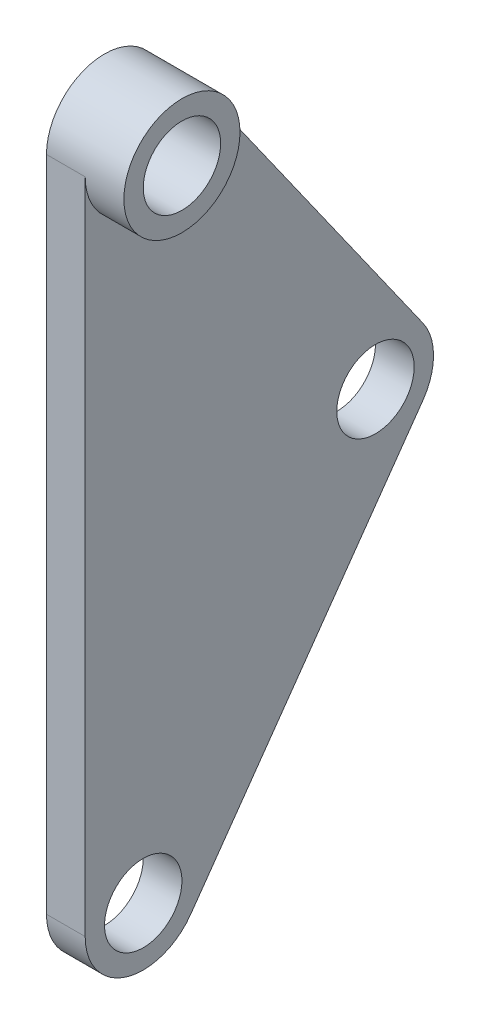
ISO-10303-21;
HEADER;
FILE_DESCRIPTION(('STEP AP214'),'2;1');
FILE_NAME('part.step','',(''),(''),'','','');
FILE_SCHEMA(('AUTOMOTIVE_DESIGN { 1 0 10303 214 1 1 1 1 }'));
ENDSEC;
DATA;
#1=APPLICATION_CONTEXT('core data for automotive mechanical design processes');
#2=APPLICATION_PROTOCOL_DEFINITION('international standard','automotive_design',2000,#1);
#3=PRODUCT_CONTEXT('',#1,'mechanical');
#4=PRODUCT('Part','Part','',(#3));
#5=PRODUCT_RELATED_PRODUCT_CATEGORY('part','',(#4));
#6=PRODUCT_DEFINITION_FORMATION('','',#4);
#7=PRODUCT_DEFINITION_CONTEXT('part definition',#1,'design');
#8=PRODUCT_DEFINITION('design','',#6,#7);
#9=PRODUCT_DEFINITION_SHAPE('','',#8);
#10=(LENGTH_UNIT() NAMED_UNIT(*) SI_UNIT(.MILLI.,.METRE.));
#11=(NAMED_UNIT(*) PLANE_ANGLE_UNIT() SI_UNIT($,.RADIAN.));
#12=(NAMED_UNIT(*) SI_UNIT($,.STERADIAN.) SOLID_ANGLE_UNIT());
#13=UNCERTAINTY_MEASURE_WITH_UNIT(LENGTH_MEASURE(1.E-05),#10,'distance_accuracy_value','');
#14=(GEOMETRIC_REPRESENTATION_CONTEXT(3) GLOBAL_UNCERTAINTY_ASSIGNED_CONTEXT((#13)) GLOBAL_UNIT_ASSIGNED_CONTEXT((#10,
#11,#12)) REPRESENTATION_CONTEXT('',''));
#15=CARTESIAN_POINT('',(0.,0.,0.));
#16=DIRECTION('',(0.,0.,1.));
#17=DIRECTION('',(1.,0.,0.));
#18=AXIS2_PLACEMENT_3D('',#15,#16,#17);
#19=CARTESIAN_POINT('',(2.,2.14575398078673,-3.03981813944787));
#20=DIRECTION('',(0.,0.576683197598655,-0.816967863264762));
#21=DIRECTION('',(0.,0.816967863264762,0.576683197598655));
#22=AXIS2_PLACEMENT_3D('',#19,#20,#21);
#23=PLANE('',#22);
#24=DIRECTION('',(0.,-0.816967863264762,-0.576683197598655));
#25=VECTOR('',#24,1.);
#26=CARTESIAN_POINT('',(0.,2.14575398078673,-3.03981813944787));
#27=LINE('',#26,#25);
#28=CARTESIAN_POINT('',(0.,-1.26995040720403,-5.45090358979429));
#29=VERTEX_POINT('',#28);
#30=CARTESIAN_POINT('',(0.,-18.269950407204,-17.4509035897943));
#31=VERTEX_POINT('',#30);
#32=EDGE_CURVE('E196',#29,#31,#27,.T.);
#33=ORIENTED_EDGE('',*,*,#32,.F.);
#34=DIRECTION('',(-1.,0.,0.));
#35=VECTOR('',#34,1.);
#36=CARTESIAN_POINT('',(2.,-1.26995040720403,-5.45090358979429));
#37=LINE('',#36,#35);
#38=CARTESIAN_POINT('',(2.,-1.26995040720403,-5.45090358979428));
#39=VERTEX_POINT('',#38);
#40=EDGE_CURVE('E212',#39,#29,#37,.T.);
#41=ORIENTED_EDGE('',*,*,#40,.F.);
#42=DIRECTION('',(0.,-0.816967863264762,-0.576683197598655));
#43=VECTOR('',#42,1.);
#44=CARTESIAN_POINT('',(2.,2.14575398078673,-3.03981813944787));
#45=LINE('',#44,#43);
#46=CARTESIAN_POINT('',(2.,-18.269950407204,-17.4509035897943));
#47=VERTEX_POINT('',#46);
#48=EDGE_CURVE('E187',#39,#47,#45,.T.);
#49=ORIENTED_EDGE('',*,*,#48,.T.);
#50=DIRECTION('',(-1.,0.,0.));
#51=VECTOR('',#50,1.);
#52=CARTESIAN_POINT('',(2.,-18.269950407204,-17.4509035897943));
#53=LINE('',#52,#51);
#54=EDGE_CURVE('E115',#47,#31,#53,.T.);
#55=ORIENTED_EDGE('',*,*,#54,.T.);
#56=EDGE_LOOP('',(#33,#41,#49,#55));
#57=FACE_BOUND('',#56,.T.);
#58=ADVANCED_FACE('F104',(#57),#23,.T.);
#59=CARTESIAN_POINT('',(2.,0.,0.));
#60=DIRECTION('',(0.,0.,-1.));
#61=DIRECTION('',(-1.,0.,0.));
#62=AXIS2_PLACEMENT_3D('',#59,#60,#61);
#63=PLANE('',#62);
#64=DIRECTION('',(0.,-1.,0.));
#65=VECTOR('',#64,1.);
#66=CARTESIAN_POINT('',(0.,0.,0.));
#67=LINE('',#66,#65);
#68=CARTESIAN_POINT('',(0.,-3.,0.));
#69=VERTEX_POINT('',#68);
#70=CARTESIAN_POINT('',(0.,-37.,0.));
#71=VERTEX_POINT('',#70);
#72=EDGE_CURVE('E168',#69,#71,#67,.T.);
#73=ORIENTED_EDGE('',*,*,#72,.T.);
#74=DIRECTION('',(-1.,0.,0.));
#75=VECTOR('',#74,1.);
#76=CARTESIAN_POINT('',(2.,-37.,0.));
#77=LINE('',#76,#75);
#78=CARTESIAN_POINT('',(2.,-37.,0.));
#79=VERTEX_POINT('',#78);
#80=EDGE_CURVE('E162',#79,#71,#77,.T.);
#81=ORIENTED_EDGE('',*,*,#80,.F.);
#82=DIRECTION('',(0.,-1.,0.));
#83=VECTOR('',#82,1.);
#84=CARTESIAN_POINT('',(2.,0.,0.));
#85=LINE('',#84,#83);
#86=CARTESIAN_POINT('',(2.,-3.,0.));
#87=VERTEX_POINT('',#86);
#88=EDGE_CURVE('E166',#87,#79,#85,.T.);
#89=ORIENTED_EDGE('',*,*,#88,.F.);
#90=DIRECTION('',(-1.,0.,0.));
#91=VECTOR('',#90,1.);
#92=CARTESIAN_POINT('',(2.,-3.,0.));
#93=LINE('',#92,#91);
#94=EDGE_CURVE('E172',#87,#69,#93,.T.);
#95=ORIENTED_EDGE('',*,*,#94,.T.);
#96=EDGE_LOOP('',(#73,#81,#89,#95));
#97=FACE_BOUND('',#96,.T.);
#98=ADVANCED_FACE('F164',(#97),#63,.F.);
#99=CARTESIAN_POINT('',(2.,-15.4482943964911,-21.8850837283624));
#100=DIRECTION('',(0.,-0.576683197598655,-0.816967863264762));
#101=DIRECTION('',(0.,0.816967863264762,-0.576683197598655));
#102=AXIS2_PLACEMENT_3D('',#99,#100,#101);
#103=PLANE('',#102);
#104=DIRECTION('',(0.,-0.816967863264762,0.576683197598655));
#105=VECTOR('',#104,1.);
#106=CARTESIAN_POINT('',(0.,-15.4482943964911,-21.8850837283624));
#107=LINE('',#106,#105);
#108=CARTESIAN_POINT('',(0.,-21.730049592796,-17.4509035897943));
#109=VERTEX_POINT('',#108);
#110=CARTESIAN_POINT('',(0.,-38.730049592796,-5.45090358979429));
#111=VERTEX_POINT('',#110);
#112=EDGE_CURVE('E193',#109,#111,#107,.T.);
#113=ORIENTED_EDGE('',*,*,#112,.F.);
#114=DIRECTION('',(-1.,0.,0.));
#115=VECTOR('',#114,1.);
#116=CARTESIAN_POINT('',(2.,-21.730049592796,-17.4509035897943));
#117=LINE('',#116,#115);
#118=CARTESIAN_POINT('',(2.,-21.730049592796,-17.4509035897943));
#119=VERTEX_POINT('',#118);
#120=EDGE_CURVE('E124',#119,#109,#117,.T.);
#121=ORIENTED_EDGE('',*,*,#120,.F.);
#122=DIRECTION('',(0.,-0.816967863264762,0.576683197598655));
#123=VECTOR('',#122,1.);
#124=CARTESIAN_POINT('',(2.,-15.4482943964911,-21.8850837283624));
#125=LINE('',#124,#123);
#126=CARTESIAN_POINT('',(2.,-38.730049592796,-5.45090358979429));
#127=VERTEX_POINT('',#126);
#128=EDGE_CURVE('E186',#119,#127,#125,.T.);
#129=ORIENTED_EDGE('',*,*,#128,.T.);
#130=DIRECTION('',(-1.,0.,0.));
#131=VECTOR('',#130,1.);
#132=CARTESIAN_POINT('',(2.,-38.730049592796,-5.45090358979429));
#133=LINE('',#132,#131);
#134=EDGE_CURVE('E145',#127,#111,#133,.T.);
#135=ORIENTED_EDGE('',*,*,#134,.T.);
#136=EDGE_LOOP('',(#113,#121,#129,#135));
#137=FACE_BOUND('',#136,.T.);
#138=ADVANCED_FACE('F275',(#137),#103,.T.);
#139=CARTESIAN_POINT('',(0.,0.,0.));
#140=DIRECTION('',(1.,0.,0.));
#141=DIRECTION('',(0.,0.,-1.));
#142=AXIS2_PLACEMENT_3D('',#139,#140,#141);
#143=PLANE('',#142);
#144=CARTESIAN_POINT('',(0.,-3.,-3.));
#145=DIRECTION('',(1.,0.,0.));
#146=DIRECTION('',(0.,0.,-1.));
#147=AXIS2_PLACEMENT_3D('',#144,#145,#146);
#148=CIRCLE('',#147,2.);
#149=CARTESIAN_POINT('',(0.,-3.,-5.));
#150=VERTEX_POINT('',#149);
#151=EDGE_CURVE('E231',#150,#150,#148,.F.);
#152=ORIENTED_EDGE('',*,*,#151,.F.);
#153=EDGE_LOOP('',(#152));
#154=FACE_BOUND('',#153,.T.);
#155=CARTESIAN_POINT('',(0.,-20.,-15.));
#156=DIRECTION('',(1.,0.,0.));
#157=DIRECTION('',(0.,0.,-1.));
#158=AXIS2_PLACEMENT_3D('',#155,#156,#157);
#159=CIRCLE('',#158,2.);
#160=CARTESIAN_POINT('',(0.,-20.,-17.));
#161=VERTEX_POINT('',#160);
#162=EDGE_CURVE('E247',#161,#161,#159,.F.);
#163=ORIENTED_EDGE('',*,*,#162,.F.);
#164=EDGE_LOOP('',(#163));
#165=FACE_BOUND('',#164,.T.);
#166=CARTESIAN_POINT('',(0.,-37.,-3.));
#167=DIRECTION('',(1.,0.,0.));
#168=DIRECTION('',(0.,0.,-1.));
#169=AXIS2_PLACEMENT_3D('',#166,#167,#168);
#170=CIRCLE('',#169,2.);
#171=CARTESIAN_POINT('',(0.,-37.,-5.));
#172=VERTEX_POINT('',#171);
#173=EDGE_CURVE('E230',#172,#172,#170,.F.);
#174=ORIENTED_EDGE('',*,*,#173,.F.);
#175=EDGE_LOOP('',(#174));
#176=FACE_BOUND('',#175,.T.);
#177=ORIENTED_EDGE('',*,*,#32,.T.);
#178=CARTESIAN_POINT('',(0.,-20.,-15.));
#179=DIRECTION('',(1.,0.,0.));
#180=DIRECTION('',(0.,0.,-1.));
#181=AXIS2_PLACEMENT_3D('',#178,#179,#180);
#182=CIRCLE('',#181,3.);
#183=EDGE_CURVE('E179',#109,#31,#182,.T.);
#184=ORIENTED_EDGE('',*,*,#183,.F.);
#185=ORIENTED_EDGE('',*,*,#112,.T.);
#186=CARTESIAN_POINT('',(0.,-37.,-3.));
#187=DIRECTION('',(1.,0.,0.));
#188=DIRECTION('',(0.,0.,-1.));
#189=AXIS2_PLACEMENT_3D('',#186,#187,#188);
#190=CIRCLE('',#189,3.);
#191=EDGE_CURVE('E180',#71,#111,#190,.T.);
#192=ORIENTED_EDGE('',*,*,#191,.F.);
#193=ORIENTED_EDGE('',*,*,#72,.F.);
#194=CARTESIAN_POINT('',(0.,-3.,-3.));
#195=DIRECTION('',(1.,0.,0.));
#196=DIRECTION('',(0.,0.,-1.));
#197=AXIS2_PLACEMENT_3D('',#194,#195,#196);
#198=CIRCLE('',#197,3.);
#199=EDGE_CURVE('E200',#29,#69,#198,.T.);
#200=ORIENTED_EDGE('',*,*,#199,.F.);
#201=EDGE_LOOP('',(#177,#184,#185,#192,#193,#200));
#202=FACE_BOUND('',#201,.T.);
#203=ADVANCED_FACE('F281',(#154,#165,#176,#202),#143,.F.);
#204=CARTESIAN_POINT('',(2.,0.,0.));
#205=DIRECTION('',(1.,0.,0.));
#206=DIRECTION('',(0.,0.,-1.));
#207=AXIS2_PLACEMENT_3D('',#204,#205,#206);
#208=PLANE('',#207);
#209=CARTESIAN_POINT('',(2.,-20.,-15.));
#210=DIRECTION('',(1.,0.,0.));
#211=DIRECTION('',(0.,0.,-1.));
#212=AXIS2_PLACEMENT_3D('',#209,#210,#211);
#213=CIRCLE('',#212,2.);
#214=CARTESIAN_POINT('',(2.,-20.,-17.));
#215=VERTEX_POINT('',#214);
#216=EDGE_CURVE('E108',#215,#215,#213,.F.);
#217=ORIENTED_EDGE('',*,*,#216,.T.);
#218=EDGE_LOOP('',(#217));
#219=FACE_BOUND('',#218,.T.);
#220=CARTESIAN_POINT('',(2.,-37.,-3.));
#221=DIRECTION('',(1.,0.,0.));
#222=DIRECTION('',(0.,0.,-1.));
#223=AXIS2_PLACEMENT_3D('',#220,#221,#222);
#224=CIRCLE('',#223,2.);
#225=CARTESIAN_POINT('',(2.,-37.,-5.));
#226=VERTEX_POINT('',#225);
#227=EDGE_CURVE('E227',#226,#226,#224,.F.);
#228=ORIENTED_EDGE('',*,*,#227,.T.);
#229=EDGE_LOOP('',(#228));
#230=FACE_BOUND('',#229,.T.);
#231=CARTESIAN_POINT('',(2.,-3.,-3.));
#232=DIRECTION('',(1.,0.,0.));
#233=DIRECTION('',(0.,0.,-1.));
#234=AXIS2_PLACEMENT_3D('',#231,#232,#233);
#235=CIRCLE('',#234,3.);
#236=EDGE_CURVE('E12',#87,#39,#235,.T.);
#237=ORIENTED_EDGE('',*,*,#236,.F.);
#238=ORIENTED_EDGE('',*,*,#88,.T.);
#239=CARTESIAN_POINT('',(2.,-37.,-3.));
#240=DIRECTION('',(1.,0.,0.));
#241=DIRECTION('',(0.,0.,-1.));
#242=AXIS2_PLACEMENT_3D('',#239,#240,#241);
#243=CIRCLE('',#242,3.);
#244=EDGE_CURVE('E175',#79,#127,#243,.T.);
#245=ORIENTED_EDGE('',*,*,#244,.T.);
#246=ORIENTED_EDGE('',*,*,#128,.F.);
#247=CARTESIAN_POINT('',(2.,-20.,-15.));
#248=DIRECTION('',(1.,0.,0.));
#249=DIRECTION('',(0.,0.,-1.));
#250=AXIS2_PLACEMENT_3D('',#247,#248,#249);
#251=CIRCLE('',#250,3.);
#252=EDGE_CURVE('E220',#119,#47,#251,.T.);
#253=ORIENTED_EDGE('',*,*,#252,.T.);
#254=ORIENTED_EDGE('',*,*,#48,.F.);
#255=EDGE_LOOP('',(#237,#238,#245,#246,#253,#254));
#256=FACE_BOUND('',#255,.T.);
#257=ADVANCED_FACE('F182',(#219,#230,#256),#208,.T.);
#258=CARTESIAN_POINT('',(2.,-37.,-3.));
#259=DIRECTION('',(-1.,0.,0.));
#260=DIRECTION('',(0.,0.,1.));
#261=AXIS2_PLACEMENT_3D('',#258,#259,#260);
#262=CYLINDRICAL_SURFACE('',#261,3.);
#263=ORIENTED_EDGE('',*,*,#244,.F.);
#264=ORIENTED_EDGE('',*,*,#80,.T.);
#265=ORIENTED_EDGE('',*,*,#191,.T.);
#266=ORIENTED_EDGE('',*,*,#134,.F.);
#267=EDGE_LOOP('',(#263,#264,#265,#266));
#268=FACE_BOUND('',#267,.T.);
#269=ADVANCED_FACE('F106',(#268),#262,.T.);
#270=CARTESIAN_POINT('',(2.,-20.,-15.));
#271=DIRECTION('',(-1.,0.,0.));
#272=DIRECTION('',(0.,0.,1.));
#273=AXIS2_PLACEMENT_3D('',#270,#271,#272);
#274=CYLINDRICAL_SURFACE('',#273,3.);
#275=ORIENTED_EDGE('',*,*,#183,.T.);
#276=ORIENTED_EDGE('',*,*,#54,.F.);
#277=ORIENTED_EDGE('',*,*,#252,.F.);
#278=ORIENTED_EDGE('',*,*,#120,.T.);
#279=EDGE_LOOP('',(#275,#276,#277,#278));
#280=FACE_BOUND('',#279,.T.);
#281=ADVANCED_FACE('F259',(#280),#274,.T.);
#282=CARTESIAN_POINT('',(2.,-3.,-3.));
#283=DIRECTION('',(-1.,0.,0.));
#284=DIRECTION('',(0.,0.,1.));
#285=AXIS2_PLACEMENT_3D('',#282,#283,#284);
#286=CYLINDRICAL_SURFACE('',#285,3.);
#287=ORIENTED_EDGE('',*,*,#94,.F.);
#288=ORIENTED_EDGE('',*,*,#236,.T.);
#289=ORIENTED_EDGE('',*,*,#40,.T.);
#290=ORIENTED_EDGE('',*,*,#199,.T.);
#291=EDGE_LOOP('',(#287,#288,#289,#290));
#292=FACE_BOUND('',#291,.T.);
#293=CARTESIAN_POINT('',(4.,-3.,-3.));
#294=DIRECTION('',(1.,0.,0.));
#295=DIRECTION('',(0.,0.,-1.));
#296=AXIS2_PLACEMENT_3D('',#293,#294,#295);
#297=CIRCLE('',#296,3.);
#298=CARTESIAN_POINT('',(4.,-3.,-6.));
#299=VERTEX_POINT('',#298);
#300=EDGE_CURVE('E226',#299,#299,#297,.T.);
#301=ORIENTED_EDGE('',*,*,#300,.F.);
#302=EDGE_LOOP('',(#301));
#303=FACE_BOUND('',#302,.T.);
#304=ADVANCED_FACE('F257',(#292,#303),#286,.T.);
#305=CARTESIAN_POINT('',(4.,-3.,-3.));
#306=DIRECTION('',(1.,0.,0.));
#307=DIRECTION('',(0.,0.,-1.));
#308=AXIS2_PLACEMENT_3D('',#305,#306,#307);
#309=PLANE('',#308);
#310=CARTESIAN_POINT('',(4.,-3.,-3.));
#311=DIRECTION('',(1.,0.,0.));
#312=DIRECTION('',(0.,0.,-1.));
#313=AXIS2_PLACEMENT_3D('',#310,#311,#312);
#314=CIRCLE('',#313,2.);
#315=CARTESIAN_POINT('',(4.,-3.,-5.));
#316=VERTEX_POINT('',#315);
#317=EDGE_CURVE('E239',#316,#316,#314,.T.);
#318=ORIENTED_EDGE('',*,*,#317,.F.);
#319=EDGE_LOOP('',(#318));
#320=FACE_BOUND('',#319,.T.);
#321=ORIENTED_EDGE('',*,*,#300,.T.);
#322=EDGE_LOOP('',(#321));
#323=FACE_BOUND('',#322,.T.);
#324=ADVANCED_FACE('F255',(#320,#323),#309,.T.);
#325=CARTESIAN_POINT('',(4.,-3.,-3.));
#326=DIRECTION('',(-1.,0.,0.));
#327=DIRECTION('',(0.,0.,1.));
#328=AXIS2_PLACEMENT_3D('',#325,#326,#327);
#329=CYLINDRICAL_SURFACE('',#328,2.);
#330=ORIENTED_EDGE('',*,*,#317,.T.);
#331=EDGE_LOOP('',(#330));
#332=FACE_BOUND('',#331,.T.);
#333=ORIENTED_EDGE('',*,*,#151,.T.);
#334=EDGE_LOOP('',(#333));
#335=FACE_BOUND('',#334,.T.);
#336=ADVANCED_FACE('F266',(#332,#335),#329,.F.);
#337=CARTESIAN_POINT('',(4.,-37.,-3.));
#338=DIRECTION('',(-1.,0.,0.));
#339=DIRECTION('',(0.,0.,1.));
#340=AXIS2_PLACEMENT_3D('',#337,#338,#339);
#341=CYLINDRICAL_SURFACE('',#340,2.);
#342=ORIENTED_EDGE('',*,*,#227,.F.);
#343=EDGE_LOOP('',(#342));
#344=FACE_BOUND('',#343,.T.);
#345=ORIENTED_EDGE('',*,*,#173,.T.);
#346=EDGE_LOOP('',(#345));
#347=FACE_BOUND('',#346,.T.);
#348=ADVANCED_FACE('F288',(#344,#347),#341,.F.);
#349=CARTESIAN_POINT('',(4.,-20.,-15.));
#350=DIRECTION('',(-1.,0.,0.));
#351=DIRECTION('',(0.,0.,1.));
#352=AXIS2_PLACEMENT_3D('',#349,#350,#351);
#353=CYLINDRICAL_SURFACE('',#352,2.);
#354=ORIENTED_EDGE('',*,*,#216,.F.);
#355=EDGE_LOOP('',(#354));
#356=FACE_BOUND('',#355,.T.);
#357=ORIENTED_EDGE('',*,*,#162,.T.);
#358=EDGE_LOOP('',(#357));
#359=FACE_BOUND('',#358,.T.);
#360=ADVANCED_FACE('F291',(#356,#359),#353,.F.);
#361=CLOSED_SHELL('',(#58,#98,#138,#203,#257,#269,#281,#304,#324,#336,#348,#360));
#362=MANIFOLD_SOLID_BREP('B2',#361);
#363=ADVANCED_BREP_SHAPE_REPRESENTATION('',(#18,#362),#14);
#364=SHAPE_DEFINITION_REPRESENTATION(#9,#363);
ENDSEC;
END-ISO-10303-21;
